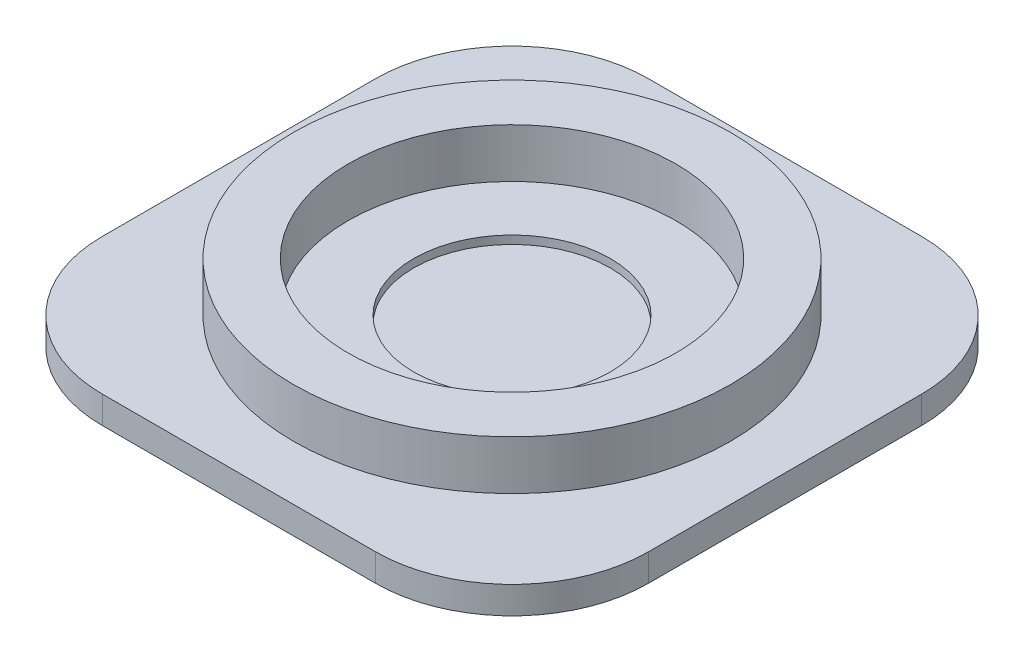
ISO-10303-21;
HEADER;
FILE_DESCRIPTION(('STEP AP214'),'2;1');
FILE_NAME('part.step','',(''),(''),'','','');
FILE_SCHEMA(('AUTOMOTIVE_DESIGN { 1 0 10303 214 1 1 1 1 }'));
ENDSEC;
DATA;
#1=APPLICATION_CONTEXT('core data for automotive mechanical design processes');
#2=APPLICATION_PROTOCOL_DEFINITION('international standard','automotive_design',2000,#1);
#3=PRODUCT_CONTEXT('',#1,'mechanical');
#4=PRODUCT('Part','Part','',(#3));
#5=PRODUCT_RELATED_PRODUCT_CATEGORY('part','',(#4));
#6=PRODUCT_DEFINITION_FORMATION('','',#4);
#7=PRODUCT_DEFINITION_CONTEXT('part definition',#1,'design');
#8=PRODUCT_DEFINITION('design','',#6,#7);
#9=PRODUCT_DEFINITION_SHAPE('','',#8);
#10=(LENGTH_UNIT() NAMED_UNIT(*) SI_UNIT(.MILLI.,.METRE.));
#11=(NAMED_UNIT(*) PLANE_ANGLE_UNIT() SI_UNIT($,.RADIAN.));
#12=(NAMED_UNIT(*) SI_UNIT($,.STERADIAN.) SOLID_ANGLE_UNIT());
#13=UNCERTAINTY_MEASURE_WITH_UNIT(LENGTH_MEASURE(1.E-05),#10,'distance_accuracy_value','');
#14=(GEOMETRIC_REPRESENTATION_CONTEXT(3) GLOBAL_UNCERTAINTY_ASSIGNED_CONTEXT((#13)) GLOBAL_UNIT_ASSIGNED_CONTEXT((#10,
#11,#12)) REPRESENTATION_CONTEXT('',''));
#15=CARTESIAN_POINT('',(0.,0.,0.));
#16=DIRECTION('',(0.,0.,1.));
#17=DIRECTION('',(1.,0.,0.));
#18=AXIS2_PLACEMENT_3D('',#15,#16,#17);
#19=CARTESIAN_POINT('',(-10.1693370177046,23.,6.79456970364072));
#20=DIRECTION('',(0.,-1.,0.));
#21=DIRECTION('',(0.,0.,-1.));
#22=AXIS2_PLACEMENT_3D('',#19,#20,#21);
#23=CYLINDRICAL_SURFACE('',#22,40.);
#24=CARTESIAN_POINT('',(-10.1693370177046,5.,6.79456970364072));
#25=DIRECTION('',(0.,1.,0.));
#26=DIRECTION('',(1.,0.,0.));
#27=AXIS2_PLACEMENT_3D('',#24,#25,#26);
#28=CIRCLE('',#27,40.);
#29=CARTESIAN_POINT('',(29.8306629822954,5.,6.79456970364072));
#30=VERTEX_POINT('',#29);
#31=EDGE_CURVE('E144',#30,#30,#28,.T.);
#32=ORIENTED_EDGE('',*,*,#31,.T.);
#33=EDGE_LOOP('',(#32));
#34=FACE_BOUND('',#33,.T.);
#35=CARTESIAN_POINT('',(-10.1693370177046,14.,6.79456970364072));
#36=DIRECTION('',(0.,1.,0.));
#37=DIRECTION('',(-1.,0.,0.));
#38=AXIS2_PLACEMENT_3D('',#35,#36,#37);
#39=CIRCLE('',#38,40.);
#40=CARTESIAN_POINT('',(-50.1693370177046,14.,6.79456970364072));
#41=VERTEX_POINT('',#40);
#42=EDGE_CURVE('E199',#41,#41,#39,.T.);
#43=ORIENTED_EDGE('',*,*,#42,.F.);
#44=EDGE_LOOP('',(#43));
#45=FACE_BOUND('',#44,.T.);
#46=ADVANCED_FACE('F41',(#34,#45),#23,.T.);
#47=CARTESIAN_POINT('',(14.8306629822955,5.,31.7945697036407));
#48=DIRECTION('',(0.,-1.,0.));
#49=DIRECTION('',(0.,0.,-1.));
#50=AXIS2_PLACEMENT_3D('',#47,#48,#49);
#51=CYLINDRICAL_SURFACE('',#50,25.);
#52=CARTESIAN_POINT('',(14.8306629822955,0.,31.7945697036407));
#53=DIRECTION('',(0.,1.,0.));
#54=DIRECTION('',(0.,0.,1.));
#55=AXIS2_PLACEMENT_3D('',#52,#53,#54);
#56=CIRCLE('',#55,25.);
#57=CARTESIAN_POINT('',(14.8306629822953,0.,56.7945697036407));
#58=VERTEX_POINT('',#57);
#59=CARTESIAN_POINT('',(39.8306629822955,0.,31.7945697036405));
#60=VERTEX_POINT('',#59);
#61=EDGE_CURVE('E140',#58,#60,#56,.T.);
#62=ORIENTED_EDGE('',*,*,#61,.T.);
#63=DIRECTION('',(0.,-1.,0.));
#64=VECTOR('',#63,1.);
#65=CARTESIAN_POINT('',(39.8306629822955,5.,31.7945697036405));
#66=LINE('',#65,#64);
#67=CARTESIAN_POINT('',(39.8306629822955,5.,31.7945697036405));
#68=VERTEX_POINT('',#67);
#69=EDGE_CURVE('E51',#68,#60,#66,.T.);
#70=ORIENTED_EDGE('',*,*,#69,.F.);
#71=CARTESIAN_POINT('',(14.8306629822955,5.,31.7945697036407));
#72=DIRECTION('',(0.,1.,0.));
#73=DIRECTION('',(0.,0.,1.));
#74=AXIS2_PLACEMENT_3D('',#71,#72,#73);
#75=CIRCLE('',#74,25.);
#76=CARTESIAN_POINT('',(14.8306629822953,5.,56.7945697036407));
#77=VERTEX_POINT('',#76);
#78=EDGE_CURVE('E155',#77,#68,#75,.T.);
#79=ORIENTED_EDGE('',*,*,#78,.F.);
#80=DIRECTION('',(0.,-1.,0.));
#81=VECTOR('',#80,1.);
#82=CARTESIAN_POINT('',(14.8306629822953,5.,56.7945697036407));
#83=LINE('',#82,#81);
#84=EDGE_CURVE('E136',#77,#58,#83,.T.);
#85=ORIENTED_EDGE('',*,*,#84,.T.);
#86=EDGE_LOOP('',(#62,#70,#79,#85));
#87=FACE_BOUND('',#86,.T.);
#88=ADVANCED_FACE('F43',(#87),#51,.T.);
#89=CARTESIAN_POINT('',(39.8306629822955,5.,-18.2054302963591));
#90=DIRECTION('',(-1.,0.,0.));
#91=DIRECTION('',(0.,0.,1.));
#92=AXIS2_PLACEMENT_3D('',#89,#90,#91);
#93=PLANE('',#92);
#94=DIRECTION('',(0.,0.,-1.));
#95=VECTOR('',#94,1.);
#96=CARTESIAN_POINT('',(39.8306629822955,0.,-18.2054302963591));
#97=LINE('',#96,#95);
#98=CARTESIAN_POINT('',(39.8306629822955,0.,-18.2054302963591));
#99=VERTEX_POINT('',#98);
#100=EDGE_CURVE('E143',#60,#99,#97,.T.);
#101=ORIENTED_EDGE('',*,*,#100,.T.);
#102=DIRECTION('',(0.,-1.,0.));
#103=VECTOR('',#102,1.);
#104=CARTESIAN_POINT('',(39.8306629822955,5.,-18.2054302963591));
#105=LINE('',#104,#103);
#106=CARTESIAN_POINT('',(39.8306629822955,5.,-18.2054302963591));
#107=VERTEX_POINT('',#106);
#108=EDGE_CURVE('E165',#107,#99,#105,.T.);
#109=ORIENTED_EDGE('',*,*,#108,.F.);
#110=DIRECTION('',(0.,0.,-1.));
#111=VECTOR('',#110,1.);
#112=CARTESIAN_POINT('',(39.8306629822955,5.,-18.2054302963591));
#113=LINE('',#112,#111);
#114=EDGE_CURVE('E103',#68,#107,#113,.T.);
#115=ORIENTED_EDGE('',*,*,#114,.F.);
#116=ORIENTED_EDGE('',*,*,#69,.T.);
#117=EDGE_LOOP('',(#101,#109,#115,#116));
#118=FACE_BOUND('',#117,.T.);
#119=ADVANCED_FACE('F169',(#118),#93,.F.);
#120=CARTESIAN_POINT('',(14.8306629822954,5.,-18.2054302963593));
#121=DIRECTION('',(0.,-1.,0.));
#122=DIRECTION('',(0.,0.,-1.));
#123=AXIS2_PLACEMENT_3D('',#120,#121,#122);
#124=CYLINDRICAL_SURFACE('',#123,25.);
#125=CARTESIAN_POINT('',(14.8306629822954,0.,-18.2054302963593));
#126=DIRECTION('',(0.,1.,0.));
#127=DIRECTION('',(0.,0.,1.));
#128=AXIS2_PLACEMENT_3D('',#125,#126,#127);
#129=CIRCLE('',#128,25.);
#130=CARTESIAN_POINT('',(14.8306629822953,0.,-43.2054302963593));
#131=VERTEX_POINT('',#130);
#132=EDGE_CURVE('E146',#99,#131,#129,.T.);
#133=ORIENTED_EDGE('',*,*,#132,.T.);
#134=DIRECTION('',(0.,-1.,0.));
#135=VECTOR('',#134,1.);
#136=CARTESIAN_POINT('',(14.8306629822953,5.,-43.2054302963593));
#137=LINE('',#136,#135);
#138=CARTESIAN_POINT('',(14.8306629822953,5.,-43.2054302963593));
#139=VERTEX_POINT('',#138);
#140=EDGE_CURVE('E162',#139,#131,#137,.T.);
#141=ORIENTED_EDGE('',*,*,#140,.F.);
#142=CARTESIAN_POINT('',(14.8306629822954,5.,-18.2054302963593));
#143=DIRECTION('',(0.,1.,0.));
#144=DIRECTION('',(0.,0.,1.));
#145=AXIS2_PLACEMENT_3D('',#142,#143,#144);
#146=CIRCLE('',#145,25.);
#147=EDGE_CURVE('E187',#107,#139,#146,.T.);
#148=ORIENTED_EDGE('',*,*,#147,.F.);
#149=ORIENTED_EDGE('',*,*,#108,.T.);
#150=EDGE_LOOP('',(#133,#141,#148,#149));
#151=FACE_BOUND('',#150,.T.);
#152=ADVANCED_FACE('F180',(#151),#124,.T.);
#153=CARTESIAN_POINT('',(-35.1693370177044,5.,-43.2054302963593));
#154=DIRECTION('',(0.,0.,1.));
#155=DIRECTION('',(1.,0.,0.));
#156=AXIS2_PLACEMENT_3D('',#153,#154,#155);
#157=PLANE('',#156);
#158=DIRECTION('',(-1.,0.,0.));
#159=VECTOR('',#158,1.);
#160=CARTESIAN_POINT('',(-35.1693370177044,0.,-43.2054302963593));
#161=LINE('',#160,#159);
#162=CARTESIAN_POINT('',(-35.1693370177044,0.,-43.2054302963593));
#163=VERTEX_POINT('',#162);
#164=EDGE_CURVE('E148',#131,#163,#161,.T.);
#165=ORIENTED_EDGE('',*,*,#164,.T.);
#166=DIRECTION('',(0.,-1.,0.));
#167=VECTOR('',#166,1.);
#168=CARTESIAN_POINT('',(-35.1693370177044,5.,-43.2054302963593));
#169=LINE('',#168,#167);
#170=CARTESIAN_POINT('',(-35.1693370177044,5.,-43.2054302963593));
#171=VERTEX_POINT('',#170);
#172=EDGE_CURVE('E159',#171,#163,#169,.T.);
#173=ORIENTED_EDGE('',*,*,#172,.F.);
#174=DIRECTION('',(-1.,0.,0.));
#175=VECTOR('',#174,1.);
#176=CARTESIAN_POINT('',(-35.1693370177044,5.,-43.2054302963593));
#177=LINE('',#176,#175);
#178=EDGE_CURVE('E186',#139,#171,#177,.T.);
#179=ORIENTED_EDGE('',*,*,#178,.F.);
#180=ORIENTED_EDGE('',*,*,#140,.T.);
#181=EDGE_LOOP('',(#165,#173,#179,#180));
#182=FACE_BOUND('',#181,.T.);
#183=ADVANCED_FACE('F184',(#182),#157,.F.);
#184=CARTESIAN_POINT('',(-35.1693370177046,5.,-18.2054302963593));
#185=DIRECTION('',(0.,-1.,0.));
#186=DIRECTION('',(0.,0.,-1.));
#187=AXIS2_PLACEMENT_3D('',#184,#185,#186);
#188=CYLINDRICAL_SURFACE('',#187,25.);
#189=CARTESIAN_POINT('',(-35.1693370177046,0.,-18.2054302963593));
#190=DIRECTION('',(0.,1.,0.));
#191=DIRECTION('',(0.,0.,1.));
#192=AXIS2_PLACEMENT_3D('',#189,#190,#191);
#193=CIRCLE('',#192,25.);
#194=CARTESIAN_POINT('',(-60.1693370177046,0.,-18.2054302963591));
#195=VERTEX_POINT('',#194);
#196=EDGE_CURVE('E150',#163,#195,#193,.T.);
#197=ORIENTED_EDGE('',*,*,#196,.T.);
#198=DIRECTION('',(0.,-1.,0.));
#199=VECTOR('',#198,1.);
#200=CARTESIAN_POINT('',(-60.1693370177046,5.,-18.2054302963591));
#201=LINE('',#200,#199);
#202=CARTESIAN_POINT('',(-60.1693370177046,5.,-18.2054302963591));
#203=VERTEX_POINT('',#202);
#204=EDGE_CURVE('E131',#203,#195,#201,.T.);
#205=ORIENTED_EDGE('',*,*,#204,.F.);
#206=CARTESIAN_POINT('',(-35.1693370177046,5.,-18.2054302963593));
#207=DIRECTION('',(0.,1.,0.));
#208=DIRECTION('',(0.,0.,1.));
#209=AXIS2_PLACEMENT_3D('',#206,#207,#208);
#210=CIRCLE('',#209,25.);
#211=EDGE_CURVE('E122',#171,#203,#210,.T.);
#212=ORIENTED_EDGE('',*,*,#211,.F.);
#213=ORIENTED_EDGE('',*,*,#172,.T.);
#214=EDGE_LOOP('',(#197,#205,#212,#213));
#215=FACE_BOUND('',#214,.T.);
#216=ADVANCED_FACE('F243',(#215),#188,.T.);
#217=CARTESIAN_POINT('',(-60.1693370177046,5.,-18.2054302963591));
#218=DIRECTION('',(1.,0.,0.));
#219=DIRECTION('',(0.,0.,-1.));
#220=AXIS2_PLACEMENT_3D('',#217,#218,#219);
#221=PLANE('',#220);
#222=DIRECTION('',(0.,0.,1.));
#223=VECTOR('',#222,1.);
#224=CARTESIAN_POINT('',(-60.1693370177046,0.,-18.2054302963591));
#225=LINE('',#224,#223);
#226=CARTESIAN_POINT('',(-60.1693370177046,0.,31.7945697036405));
#227=VERTEX_POINT('',#226);
#228=EDGE_CURVE('E130',#195,#227,#225,.T.);
#229=ORIENTED_EDGE('',*,*,#228,.T.);
#230=DIRECTION('',(0.,-1.,0.));
#231=VECTOR('',#230,1.);
#232=CARTESIAN_POINT('',(-60.1693370177046,5.,31.7945697036405));
#233=LINE('',#232,#231);
#234=CARTESIAN_POINT('',(-60.1693370177046,5.,31.7945697036405));
#235=VERTEX_POINT('',#234);
#236=EDGE_CURVE('E127',#235,#227,#233,.T.);
#237=ORIENTED_EDGE('',*,*,#236,.F.);
#238=DIRECTION('',(0.,0.,1.));
#239=VECTOR('',#238,1.);
#240=CARTESIAN_POINT('',(-60.1693370177046,5.,-18.2054302963591));
#241=LINE('',#240,#239);
#242=EDGE_CURVE('E116',#203,#235,#241,.T.);
#243=ORIENTED_EDGE('',*,*,#242,.F.);
#244=ORIENTED_EDGE('',*,*,#204,.T.);
#245=EDGE_LOOP('',(#229,#237,#243,#244));
#246=FACE_BOUND('',#245,.T.);
#247=ADVANCED_FACE('F128',(#246),#221,.F.);
#248=CARTESIAN_POINT('',(-35.1693370177046,5.,31.7945697036407));
#249=DIRECTION('',(0.,-1.,0.));
#250=DIRECTION('',(0.,0.,-1.));
#251=AXIS2_PLACEMENT_3D('',#248,#249,#250);
#252=CYLINDRICAL_SURFACE('',#251,25.);
#253=CARTESIAN_POINT('',(-35.1693370177046,0.,31.7945697036407));
#254=DIRECTION('',(0.,1.,0.));
#255=DIRECTION('',(0.,0.,-1.));
#256=AXIS2_PLACEMENT_3D('',#253,#254,#255);
#257=CIRCLE('',#256,25.);
#258=CARTESIAN_POINT('',(-35.1693370177044,0.,56.7945697036407));
#259=VERTEX_POINT('',#258);
#260=EDGE_CURVE('E88',#227,#259,#257,.T.);
#261=ORIENTED_EDGE('',*,*,#260,.T.);
#262=DIRECTION('',(0.,-1.,0.));
#263=VECTOR('',#262,1.);
#264=CARTESIAN_POINT('',(-35.1693370177044,5.,56.7945697036407));
#265=LINE('',#264,#263);
#266=CARTESIAN_POINT('',(-35.1693370177044,5.,56.7945697036407));
#267=VERTEX_POINT('',#266);
#268=EDGE_CURVE('E132',#267,#259,#265,.T.);
#269=ORIENTED_EDGE('',*,*,#268,.F.);
#270=CARTESIAN_POINT('',(-35.1693370177046,5.,31.7945697036407));
#271=DIRECTION('',(0.,1.,0.));
#272=DIRECTION('',(0.,0.,-1.));
#273=AXIS2_PLACEMENT_3D('',#270,#271,#272);
#274=CIRCLE('',#273,25.);
#275=EDGE_CURVE('E120',#235,#267,#274,.T.);
#276=ORIENTED_EDGE('',*,*,#275,.F.);
#277=ORIENTED_EDGE('',*,*,#236,.T.);
#278=EDGE_LOOP('',(#261,#269,#276,#277));
#279=FACE_BOUND('',#278,.T.);
#280=ADVANCED_FACE('F134',(#279),#252,.T.);
#281=CARTESIAN_POINT('',(-35.1693370177044,5.,56.7945697036407));
#282=DIRECTION('',(0.,0.,-1.));
#283=DIRECTION('',(-1.,0.,0.));
#284=AXIS2_PLACEMENT_3D('',#281,#282,#283);
#285=PLANE('',#284);
#286=DIRECTION('',(1.,0.,0.));
#287=VECTOR('',#286,1.);
#288=CARTESIAN_POINT('',(-35.1693370177044,0.,56.7945697036407));
#289=LINE('',#288,#287);
#290=EDGE_CURVE('E94',#259,#58,#289,.T.);
#291=ORIENTED_EDGE('',*,*,#290,.T.);
#292=ORIENTED_EDGE('',*,*,#84,.F.);
#293=DIRECTION('',(1.,0.,0.));
#294=VECTOR('',#293,1.);
#295=CARTESIAN_POINT('',(-35.1693370177044,5.,56.7945697036407));
#296=LINE('',#295,#294);
#297=EDGE_CURVE('E59',#267,#77,#296,.T.);
#298=ORIENTED_EDGE('',*,*,#297,.F.);
#299=ORIENTED_EDGE('',*,*,#268,.T.);
#300=EDGE_LOOP('',(#291,#292,#298,#299));
#301=FACE_BOUND('',#300,.T.);
#302=ADVANCED_FACE('F233',(#301),#285,.F.);
#303=CARTESIAN_POINT('',(14.8306629822955,5.,31.7945697036407));
#304=DIRECTION('',(0.,1.,0.));
#305=DIRECTION('',(0.,0.,1.));
#306=AXIS2_PLACEMENT_3D('',#303,#304,#305);
#307=PLANE('',#306);
#308=ORIENTED_EDGE('',*,*,#31,.F.);
#309=EDGE_LOOP('',(#308));
#310=FACE_BOUND('',#309,.T.);
#311=ORIENTED_EDGE('',*,*,#78,.T.);
#312=ORIENTED_EDGE('',*,*,#114,.T.);
#313=ORIENTED_EDGE('',*,*,#147,.T.);
#314=ORIENTED_EDGE('',*,*,#178,.T.);
#315=ORIENTED_EDGE('',*,*,#211,.T.);
#316=ORIENTED_EDGE('',*,*,#242,.T.);
#317=ORIENTED_EDGE('',*,*,#275,.T.);
#318=ORIENTED_EDGE('',*,*,#297,.T.);
#319=EDGE_LOOP('',(#311,#312,#313,#314,#315,#316,#317,#318));
#320=FACE_BOUND('',#319,.T.);
#321=ADVANCED_FACE('F118',(#310,#320),#307,.T.);
#322=CARTESIAN_POINT('',(14.8306629822955,0.,31.7945697036407));
#323=DIRECTION('',(0.,1.,0.));
#324=DIRECTION('',(0.,0.,1.));
#325=AXIS2_PLACEMENT_3D('',#322,#323,#324);
#326=PLANE('',#325);
#327=ORIENTED_EDGE('',*,*,#61,.F.);
#328=ORIENTED_EDGE('',*,*,#290,.F.);
#329=ORIENTED_EDGE('',*,*,#260,.F.);
#330=ORIENTED_EDGE('',*,*,#228,.F.);
#331=ORIENTED_EDGE('',*,*,#196,.F.);
#332=ORIENTED_EDGE('',*,*,#164,.F.);
#333=ORIENTED_EDGE('',*,*,#132,.F.);
#334=ORIENTED_EDGE('',*,*,#100,.F.);
#335=EDGE_LOOP('',(#327,#328,#329,#330,#331,#332,#333,#334));
#336=FACE_BOUND('',#335,.T.);
#337=ADVANCED_FACE('F174',(#336),#326,.F.);
#338=CARTESIAN_POINT('',(29.8306629822954,14.,85.2945697036408));
#339=DIRECTION('',(0.,1.,0.));
#340=DIRECTION('',(-1.,0.,0.));
#341=AXIS2_PLACEMENT_3D('',#338,#339,#340);
#342=PLANE('',#341);
#343=CARTESIAN_POINT('',(-10.1693370177046,14.,6.79456970364072));
#344=DIRECTION('',(0.,1.,0.));
#345=DIRECTION('',(-1.,0.,0.));
#346=AXIS2_PLACEMENT_3D('',#343,#344,#345);
#347=CIRCLE('',#346,30.);
#348=CARTESIAN_POINT('',(-40.1693370177045,14.,6.79456970364072));
#349=VERTEX_POINT('',#348);
#350=EDGE_CURVE('E45',#349,#349,#347,.T.);
#351=ORIENTED_EDGE('',*,*,#350,.F.);
#352=EDGE_LOOP('',(#351));
#353=FACE_BOUND('',#352,.T.);
#354=ORIENTED_EDGE('',*,*,#42,.T.);
#355=EDGE_LOOP('',(#354));
#356=FACE_BOUND('',#355,.T.);
#357=ADVANCED_FACE('F210',(#353,#356),#342,.T.);
#358=CARTESIAN_POINT('',(-10.1693370177046,3.5,6.79456970364072));
#359=DIRECTION('',(0.,1.,0.));
#360=DIRECTION('',(0.,0.,1.));
#361=AXIS2_PLACEMENT_3D('',#358,#359,#360);
#362=PLANE('',#361);
#363=CARTESIAN_POINT('',(-10.1693370177046,3.5,6.79456970364072));
#364=DIRECTION('',(0.,1.,0.));
#365=DIRECTION('',(0.,0.,1.));
#366=AXIS2_PLACEMENT_3D('',#363,#364,#365);
#367=CIRCLE('',#366,18.);
#368=CARTESIAN_POINT('',(-10.1693370177046,3.5,24.7945697036407));
#369=VERTEX_POINT('',#368);
#370=EDGE_CURVE('E195',#369,#369,#367,.T.);
#371=ORIENTED_EDGE('',*,*,#370,.T.);
#372=EDGE_LOOP('',(#371));
#373=FACE_BOUND('',#372,.T.);
#374=ADVANCED_FACE('F212',(#373),#362,.T.);
#375=CARTESIAN_POINT('',(-10.1693370177046,3.5,6.79456970364072));
#376=DIRECTION('',(0.,1.,0.));
#377=DIRECTION('',(0.,0.,1.));
#378=AXIS2_PLACEMENT_3D('',#375,#376,#377);
#379=CYLINDRICAL_SURFACE('',#378,18.);
#380=ORIENTED_EDGE('',*,*,#370,.F.);
#381=EDGE_LOOP('',(#380));
#382=FACE_BOUND('',#381,.T.);
#383=CARTESIAN_POINT('',(-10.1693370177046,5.,6.79456970364072));
#384=DIRECTION('',(0.,1.,0.));
#385=DIRECTION('',(0.,0.,1.));
#386=AXIS2_PLACEMENT_3D('',#383,#384,#385);
#387=CIRCLE('',#386,18.);
#388=CARTESIAN_POINT('',(-10.1693370177046,5.,24.7945697036407));
#389=VERTEX_POINT('',#388);
#390=EDGE_CURVE('E196',#389,#389,#387,.T.);
#391=ORIENTED_EDGE('',*,*,#390,.T.);
#392=EDGE_LOOP('',(#391));
#393=FACE_BOUND('',#392,.T.);
#394=ADVANCED_FACE('F218',(#382,#393),#379,.F.);
#395=ORIENTED_EDGE('',*,*,#390,.F.);
#396=EDGE_LOOP('',(#395));
#397=FACE_BOUND('',#396,.T.);
#398=CARTESIAN_POINT('',(-10.1693370177046,5.,6.79456970364072));
#399=DIRECTION('',(0.,1.,0.));
#400=DIRECTION('',(0.,0.,1.));
#401=AXIS2_PLACEMENT_3D('',#398,#399,#400);
#402=CIRCLE('',#401,30.);
#403=CARTESIAN_POINT('',(-10.1693370177046,5.,36.7945697036407));
#404=VERTEX_POINT('',#403);
#405=EDGE_CURVE('E12',#404,#404,#402,.F.);
#406=ORIENTED_EDGE('',*,*,#405,.F.);
#407=EDGE_LOOP('',(#406));
#408=FACE_BOUND('',#407,.T.);
#409=ADVANCED_FACE('F235',(#397,#408),#307,.T.);
#410=CARTESIAN_POINT('',(-10.1693370177046,23.,6.79456970364072));
#411=DIRECTION('',(0.,-1.,0.));
#412=DIRECTION('',(0.,0.,-1.));
#413=AXIS2_PLACEMENT_3D('',#410,#411,#412);
#414=CYLINDRICAL_SURFACE('',#413,30.);
#415=ORIENTED_EDGE('',*,*,#405,.T.);
#416=EDGE_LOOP('',(#415));
#417=FACE_BOUND('',#416,.T.);
#418=ORIENTED_EDGE('',*,*,#350,.T.);
#419=EDGE_LOOP('',(#418));
#420=FACE_BOUND('',#419,.T.);
#421=ADVANCED_FACE('F208',(#417,#420),#414,.F.);
#422=CLOSED_SHELL('',(#46,#88,#119,#152,#183,#216,#247,#280,#302,#321,#337,#357,#374,#394,#409,#421));
#423=MANIFOLD_SOLID_BREP('B2',#422);
#424=ADVANCED_BREP_SHAPE_REPRESENTATION('',(#18,#423),#14);
#425=SHAPE_DEFINITION_REPRESENTATION(#9,#424);
ENDSEC;
END-ISO-10303-21;
